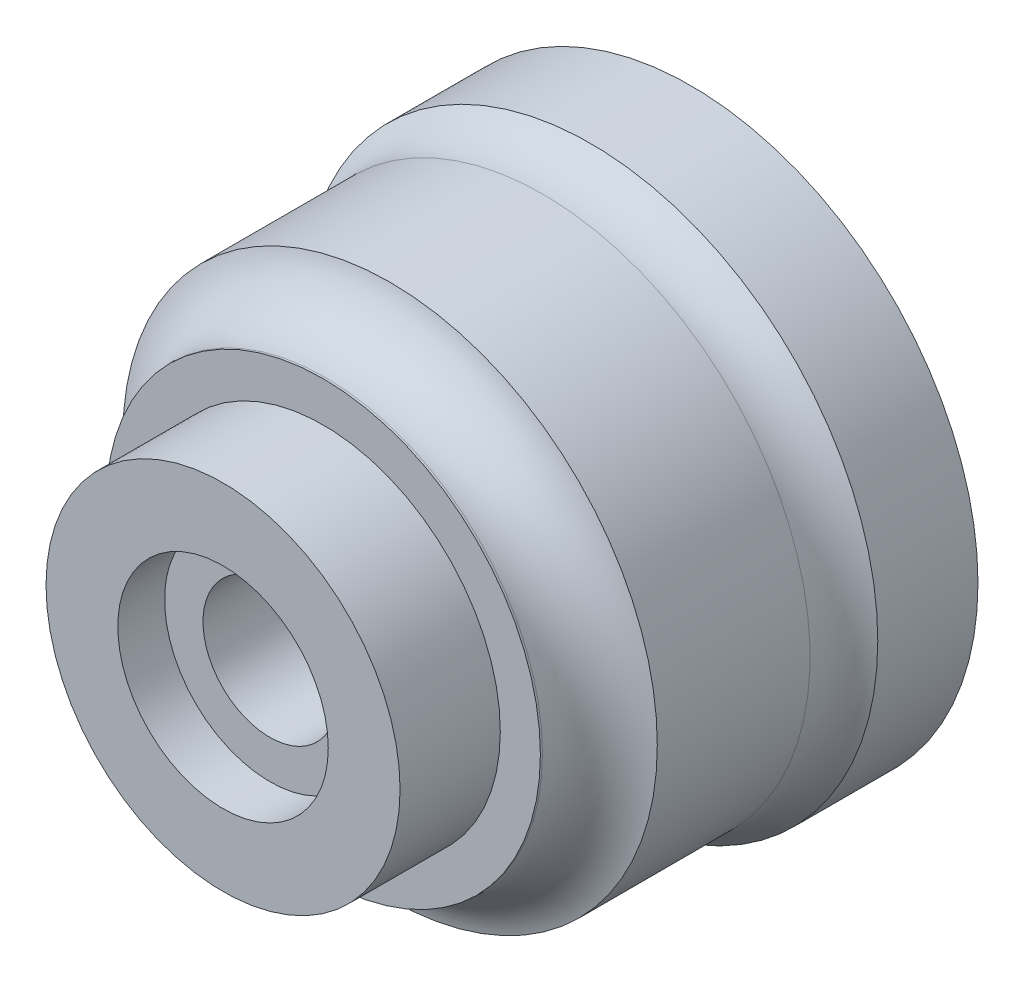
ISO-10303-21;
HEADER;
FILE_DESCRIPTION(('STEP AP214'),'2;1');
FILE_NAME('part.step','',(''),(''),'','','');
FILE_SCHEMA(('AUTOMOTIVE_DESIGN { 1 0 10303 214 1 1 1 1 }'));
ENDSEC;
DATA;
#1=APPLICATION_CONTEXT('core data for automotive mechanical design processes');
#2=APPLICATION_PROTOCOL_DEFINITION('international standard','automotive_design',2000,#1);
#3=PRODUCT_CONTEXT('',#1,'mechanical');
#4=PRODUCT('Part','Part','',(#3));
#5=PRODUCT_RELATED_PRODUCT_CATEGORY('part','',(#4));
#6=PRODUCT_DEFINITION_FORMATION('','',#4);
#7=PRODUCT_DEFINITION_CONTEXT('part definition',#1,'design');
#8=PRODUCT_DEFINITION('design','',#6,#7);
#9=PRODUCT_DEFINITION_SHAPE('','',#8);
#10=(LENGTH_UNIT() NAMED_UNIT(*) SI_UNIT(.MILLI.,.METRE.));
#11=(NAMED_UNIT(*) PLANE_ANGLE_UNIT() SI_UNIT($,.RADIAN.));
#12=(NAMED_UNIT(*) SI_UNIT($,.STERADIAN.) SOLID_ANGLE_UNIT());
#13=UNCERTAINTY_MEASURE_WITH_UNIT(LENGTH_MEASURE(1.E-05),#10,'distance_accuracy_value','');
#14=(GEOMETRIC_REPRESENTATION_CONTEXT(3) GLOBAL_UNCERTAINTY_ASSIGNED_CONTEXT((#13)) GLOBAL_UNIT_ASSIGNED_CONTEXT((#10,
#11,#12)) REPRESENTATION_CONTEXT('',''));
#15=CARTESIAN_POINT('',(0.,0.,0.));
#16=DIRECTION('',(0.,0.,1.));
#17=DIRECTION('',(1.,0.,0.));
#18=AXIS2_PLACEMENT_3D('',#15,#16,#17);
#19=CARTESIAN_POINT('',(0.,0.,55.));
#20=DIRECTION('',(0.,0.,-1.));
#21=DIRECTION('',(-1.,0.,0.));
#22=AXIS2_PLACEMENT_3D('',#19,#20,#21);
#23=CYLINDRICAL_SURFACE('',#22,10.);
#24=CARTESIAN_POINT('',(0.,0.,45.));
#25=DIRECTION('',(0.,0.,1.));
#26=DIRECTION('',(1.,0.,0.));
#27=AXIS2_PLACEMENT_3D('',#24,#25,#26);
#28=CIRCLE('',#27,10.);
#29=CARTESIAN_POINT('',(10.,0.,45.));
#30=VERTEX_POINT('',#29);
#31=EDGE_CURVE('E70',#30,#30,#28,.T.);
#32=ORIENTED_EDGE('',*,*,#31,.F.);
#33=EDGE_LOOP('',(#32));
#34=FACE_BOUND('',#33,.T.);
#35=CARTESIAN_POINT('',(0.,0.,63.));
#36=DIRECTION('',(0.,0.,1.));
#37=DIRECTION('',(1.,0.,0.));
#38=AXIS2_PLACEMENT_3D('',#35,#36,#37);
#39=CIRCLE('',#38,10.);
#40=CARTESIAN_POINT('',(10.,0.,63.));
#41=VERTEX_POINT('',#40);
#42=EDGE_CURVE('E52',#41,#41,#39,.T.);
#43=ORIENTED_EDGE('',*,*,#42,.T.);
#44=EDGE_LOOP('',(#43));
#45=FACE_BOUND('',#44,.T.);
#46=ADVANCED_FACE('F33',(#34,#45),#23,.F.);
#47=CARTESIAN_POINT('',(0.,0.,55.));
#48=DIRECTION('',(0.,0.,1.));
#49=DIRECTION('',(1.,0.,0.));
#50=AXIS2_PLACEMENT_3D('',#47,#48,#49);
#51=PLANE('',#50);
#52=CARTESIAN_POINT('',(0.,0.,55.));
#53=DIRECTION('',(0.,0.,1.));
#54=DIRECTION('',(1.,0.,0.));
#55=AXIS2_PLACEMENT_3D('',#52,#53,#54);
#56=CIRCLE('',#55,32.5);
#57=CARTESIAN_POINT('',(32.5,0.,55.));
#58=VERTEX_POINT('',#57);
#59=EDGE_CURVE('E74',#58,#58,#56,.T.);
#60=ORIENTED_EDGE('',*,*,#59,.T.);
#61=EDGE_LOOP('',(#60));
#62=FACE_BOUND('',#61,.T.);
#63=CARTESIAN_POINT('',(0.,0.,55.));
#64=DIRECTION('',(0.,0.,1.));
#65=DIRECTION('',(1.,0.,0.));
#66=AXIS2_PLACEMENT_3D('',#63,#64,#65);
#67=CIRCLE('',#66,26.5);
#68=CARTESIAN_POINT('',(26.5,0.,55.));
#69=VERTEX_POINT('',#68);
#70=EDGE_CURVE('E54',#69,#69,#67,.T.);
#71=ORIENTED_EDGE('',*,*,#70,.F.);
#72=EDGE_LOOP('',(#71));
#73=FACE_BOUND('',#72,.T.);
#74=ADVANCED_FACE('F118',(#62,#73),#51,.T.);
#75=CARTESIAN_POINT('',(0.,0.,15.));
#76=DIRECTION('',(0.,0.,1.));
#77=DIRECTION('',(1.,0.,0.));
#78=AXIS2_PLACEMENT_3D('',#75,#76,#77);
#79=PLANE('',#78);
#80=CARTESIAN_POINT('',(0.,0.,15.));
#81=DIRECTION('',(0.,0.,1.));
#82=DIRECTION('',(1.,0.,0.));
#83=AXIS2_PLACEMENT_3D('',#80,#81,#82);
#84=CIRCLE('',#83,19.);
#85=CARTESIAN_POINT('',(19.,0.,15.));
#86=VERTEX_POINT('',#85);
#87=EDGE_CURVE('E44',#86,#86,#84,.F.);
#88=ORIENTED_EDGE('',*,*,#87,.F.);
#89=EDGE_LOOP('',(#88));
#90=FACE_BOUND('',#89,.T.);
#91=CARTESIAN_POINT('',(0.,0.,15.));
#92=DIRECTION('',(0.,0.,1.));
#93=DIRECTION('',(1.,0.,0.));
#94=AXIS2_PLACEMENT_3D('',#91,#92,#93);
#95=CIRCLE('',#94,18.9);
#96=CARTESIAN_POINT('',(18.9,0.,15.));
#97=VERTEX_POINT('',#96);
#98=EDGE_CURVE('E84',#97,#97,#95,.T.);
#99=ORIENTED_EDGE('',*,*,#98,.F.);
#100=EDGE_LOOP('',(#99));
#101=FACE_BOUND('',#100,.T.);
#102=ADVANCED_FACE('F99',(#90,#101),#79,.T.);
#103=CARTESIAN_POINT('',(0.,0.,0.));
#104=DIRECTION('',(0.,0.,1.));
#105=DIRECTION('',(1.,0.,0.));
#106=AXIS2_PLACEMENT_3D('',#103,#104,#105);
#107=PLANE('',#106);
#108=CARTESIAN_POINT('',(0.,0.,0.));
#109=DIRECTION('',(0.,0.,1.));
#110=DIRECTION('',(1.,0.,0.));
#111=AXIS2_PLACEMENT_3D('',#108,#109,#110);
#112=CIRCLE('',#111,43.);
#113=CARTESIAN_POINT('',(43.,0.,0.));
#114=VERTEX_POINT('',#113);
#115=EDGE_CURVE('E87',#114,#114,#112,.T.);
#116=ORIENTED_EDGE('',*,*,#115,.F.);
#117=EDGE_LOOP('',(#116));
#118=FACE_BOUND('',#117,.T.);
#119=CARTESIAN_POINT('',(0.,0.,0.));
#120=DIRECTION('',(0.,0.,1.));
#121=DIRECTION('',(1.,0.,0.));
#122=AXIS2_PLACEMENT_3D('',#119,#120,#121);
#123=CIRCLE('',#122,18.9);
#124=CARTESIAN_POINT('',(18.9,0.,0.));
#125=VERTEX_POINT('',#124);
#126=EDGE_CURVE('E83',#125,#125,#123,.T.);
#127=ORIENTED_EDGE('',*,*,#126,.T.);
#128=EDGE_LOOP('',(#127));
#129=FACE_BOUND('',#128,.T.);
#130=ADVANCED_FACE('F96',(#118,#129),#107,.F.);
#131=CARTESIAN_POINT('',(0.,0.,15.));
#132=DIRECTION('',(0.,0.,-1.));
#133=DIRECTION('',(-1.,0.,0.));
#134=AXIS2_PLACEMENT_3D('',#131,#132,#133);
#135=CYLINDRICAL_SURFACE('',#134,43.);
#136=CARTESIAN_POINT('',(0.,0.,15.));
#137=DIRECTION('',(0.,0.,1.));
#138=DIRECTION('',(1.,0.,0.));
#139=AXIS2_PLACEMENT_3D('',#136,#137,#138);
#140=CIRCLE('',#139,43.);
#141=CARTESIAN_POINT('',(43.,0.,15.));
#142=VERTEX_POINT('',#141);
#143=EDGE_CURVE('E49',#142,#142,#140,.T.);
#144=ORIENTED_EDGE('',*,*,#143,.F.);
#145=EDGE_LOOP('',(#144));
#146=FACE_BOUND('',#145,.T.);
#147=ORIENTED_EDGE('',*,*,#115,.T.);
#148=EDGE_LOOP('',(#147));
#149=FACE_BOUND('',#148,.T.);
#150=ADVANCED_FACE('F94',(#146,#149),#135,.T.);
#151=CARTESIAN_POINT('',(0.,0.,15.));
#152=DIRECTION('',(0.,0.,-1.));
#153=DIRECTION('',(-1.,0.,0.));
#154=AXIS2_PLACEMENT_3D('',#151,#152,#153);
#155=CYLINDRICAL_SURFACE('',#154,18.9);
#156=ORIENTED_EDGE('',*,*,#98,.T.);
#157=EDGE_LOOP('',(#156));
#158=FACE_BOUND('',#157,.T.);
#159=ORIENTED_EDGE('',*,*,#126,.F.);
#160=EDGE_LOOP('',(#159));
#161=FACE_BOUND('',#160,.T.);
#162=ADVANCED_FACE('F103',(#158,#161),#155,.F.);
#163=CARTESIAN_POINT('',(0.,0.,45.));
#164=DIRECTION('',(0.,0.,-1.));
#165=DIRECTION('',(-1.,0.,0.));
#166=AXIS2_PLACEMENT_3D('',#163,#164,#165);
#167=CYLINDRICAL_SURFACE('',#166,40.);
#168=CARTESIAN_POINT('',(0.,0.,22.1414284285428));
#169=DIRECTION('',(0.,0.,-1.));
#170=DIRECTION('',(-1.,0.,0.));
#171=AXIS2_PLACEMENT_3D('',#168,#169,#170);
#172=CIRCLE('',#171,40.);
#173=CARTESIAN_POINT('',(-40.,0.,22.1414284285428));
#174=VERTEX_POINT('',#173);
#175=EDGE_CURVE('E40',#174,#174,#172,.F.);
#176=ORIENTED_EDGE('',*,*,#175,.T.);
#177=EDGE_LOOP('',(#176));
#178=FACE_BOUND('',#177,.T.);
#179=CARTESIAN_POINT('',(0.,0.,45.));
#180=DIRECTION('',(0.,0.,1.));
#181=DIRECTION('',(1.,0.,0.));
#182=AXIS2_PLACEMENT_3D('',#179,#180,#181);
#183=CIRCLE('',#182,40.);
#184=CARTESIAN_POINT('',(40.,0.,45.));
#185=VERTEX_POINT('',#184);
#186=EDGE_CURVE('E80',#185,#185,#183,.T.);
#187=ORIENTED_EDGE('',*,*,#186,.F.);
#188=EDGE_LOOP('',(#187));
#189=FACE_BOUND('',#188,.T.);
#190=ADVANCED_FACE('F105',(#178,#189),#167,.T.);
#191=CARTESIAN_POINT('',(0.,0.,45.));
#192=DIRECTION('',(0.,0.,-1.));
#193=DIRECTION('',(-1.,0.,0.));
#194=AXIS2_PLACEMENT_3D('',#191,#192,#193);
#195=CYLINDRICAL_SURFACE('',#194,19.);
#196=CARTESIAN_POINT('',(0.,0.,45.));
#197=DIRECTION('',(0.,0.,1.));
#198=DIRECTION('',(1.,0.,0.));
#199=AXIS2_PLACEMENT_3D('',#196,#197,#198);
#200=CIRCLE('',#199,19.);
#201=CARTESIAN_POINT('',(19.,0.,45.));
#202=VERTEX_POINT('',#201);
#203=EDGE_CURVE('E77',#202,#202,#200,.T.);
#204=ORIENTED_EDGE('',*,*,#203,.T.);
#205=EDGE_LOOP('',(#204));
#206=FACE_BOUND('',#205,.T.);
#207=ORIENTED_EDGE('',*,*,#87,.T.);
#208=EDGE_LOOP('',(#207));
#209=FACE_BOUND('',#208,.T.);
#210=ADVANCED_FACE('F112',(#206,#209),#195,.F.);
#211=CARTESIAN_POINT('',(0.,0.,45.));
#212=DIRECTION('',(0.,0.,1.));
#213=DIRECTION('',(1.,0.,0.));
#214=AXIS2_PLACEMENT_3D('',#211,#212,#213);
#215=PLANE('',#214);
#216=ORIENTED_EDGE('',*,*,#203,.F.);
#217=EDGE_LOOP('',(#216));
#218=FACE_BOUND('',#217,.T.);
#219=ORIENTED_EDGE('',*,*,#31,.T.);
#220=EDGE_LOOP('',(#219));
#221=FACE_BOUND('',#220,.T.);
#222=ADVANCED_FACE('F131',(#218,#221),#215,.F.);
#223=CARTESIAN_POINT('',(0.,0.,55.));
#224=DIRECTION('',(0.,0.,-1.));
#225=DIRECTION('',(-1.,0.,0.));
#226=AXIS2_PLACEMENT_3D('',#223,#224,#225);
#227=CYLINDRICAL_SURFACE('',#226,32.5);
#228=CARTESIAN_POINT('',(0.,0.,54.6824583655185));
#229=DIRECTION('',(0.,0.,-1.));
#230=DIRECTION('',(-1.,0.,0.));
#231=AXIS2_PLACEMENT_3D('',#228,#229,#230);
#232=CIRCLE('',#231,32.5);
#233=CARTESIAN_POINT('',(-32.5,0.,54.6824583655185));
#234=VERTEX_POINT('',#233);
#235=EDGE_CURVE('E10',#234,#234,#232,.F.);
#236=ORIENTED_EDGE('',*,*,#235,.T.);
#237=EDGE_LOOP('',(#236));
#238=FACE_BOUND('',#237,.T.);
#239=ORIENTED_EDGE('',*,*,#59,.F.);
#240=EDGE_LOOP('',(#239));
#241=FACE_BOUND('',#240,.T.);
#242=ADVANCED_FACE('F134',(#238,#241),#227,.T.);
#243=CARTESIAN_POINT('',(0.,0.,22.1414284285428));
#244=DIRECTION('',(0.,0.,-1.));
#245=DIRECTION('',(-1.,0.,0.));
#246=AXIS2_PLACEMENT_3D('',#243,#244,#245);
#247=TOROIDAL_SURFACE('',#246,50.,10.);
#248=ORIENTED_EDGE('',*,*,#143,.T.);
#249=EDGE_LOOP('',(#248));
#250=FACE_BOUND('',#249,.T.);
#251=ORIENTED_EDGE('',*,*,#175,.F.);
#252=EDGE_LOOP('',(#251));
#253=FACE_BOUND('',#252,.T.);
#254=ADVANCED_FACE('F138',(#250,#253),#247,.F.);
#255=CARTESIAN_POINT('',(0.,0.,70.));
#256=DIRECTION('',(0.,0.,1.));
#257=DIRECTION('',(1.,0.,0.));
#258=AXIS2_PLACEMENT_3D('',#255,#256,#257);
#259=PLANE('',#258);
#260=CARTESIAN_POINT('',(0.,0.,70.));
#261=DIRECTION('',(0.,0.,1.));
#262=DIRECTION('',(1.,0.,0.));
#263=AXIS2_PLACEMENT_3D('',#260,#261,#262);
#264=CIRCLE('',#263,15.75);
#265=CARTESIAN_POINT('',(15.75,0.,70.));
#266=VERTEX_POINT('',#265);
#267=EDGE_CURVE('E62',#266,#266,#264,.T.);
#268=ORIENTED_EDGE('',*,*,#267,.F.);
#269=EDGE_LOOP('',(#268));
#270=FACE_BOUND('',#269,.T.);
#271=CARTESIAN_POINT('',(0.,0.,70.));
#272=DIRECTION('',(0.,0.,1.));
#273=DIRECTION('',(1.,0.,0.));
#274=AXIS2_PLACEMENT_3D('',#271,#272,#273);
#275=CIRCLE('',#274,26.5);
#276=CARTESIAN_POINT('',(26.5,0.,70.));
#277=VERTEX_POINT('',#276);
#278=EDGE_CURVE('E59',#277,#277,#275,.T.);
#279=ORIENTED_EDGE('',*,*,#278,.T.);
#280=EDGE_LOOP('',(#279));
#281=FACE_BOUND('',#280,.T.);
#282=ADVANCED_FACE('F153',(#270,#281),#259,.T.);
#283=CARTESIAN_POINT('',(0.,0.,70.));
#284=DIRECTION('',(0.,0.,-1.));
#285=DIRECTION('',(-1.,0.,0.));
#286=AXIS2_PLACEMENT_3D('',#283,#284,#285);
#287=CYLINDRICAL_SURFACE('',#286,26.5);
#288=ORIENTED_EDGE('',*,*,#278,.F.);
#289=EDGE_LOOP('',(#288));
#290=FACE_BOUND('',#289,.T.);
#291=ORIENTED_EDGE('',*,*,#70,.T.);
#292=EDGE_LOOP('',(#291));
#293=FACE_BOUND('',#292,.T.);
#294=ADVANCED_FACE('F128',(#290,#293),#287,.T.);
#295=CARTESIAN_POINT('',(0.,0.,63.));
#296=DIRECTION('',(0.,0.,1.));
#297=DIRECTION('',(1.,0.,0.));
#298=AXIS2_PLACEMENT_3D('',#295,#296,#297);
#299=CYLINDRICAL_SURFACE('',#298,15.75);
#300=CARTESIAN_POINT('',(0.,0.,63.));
#301=DIRECTION('',(0.,0.,1.));
#302=DIRECTION('',(1.,0.,0.));
#303=AXIS2_PLACEMENT_3D('',#300,#301,#302);
#304=CIRCLE('',#303,15.75);
#305=CARTESIAN_POINT('',(15.75,0.,63.));
#306=VERTEX_POINT('',#305);
#307=EDGE_CURVE('E55',#306,#306,#304,.T.);
#308=ORIENTED_EDGE('',*,*,#307,.F.);
#309=EDGE_LOOP('',(#308));
#310=FACE_BOUND('',#309,.T.);
#311=ORIENTED_EDGE('',*,*,#267,.T.);
#312=EDGE_LOOP('',(#311));
#313=FACE_BOUND('',#312,.T.);
#314=ADVANCED_FACE('F164',(#310,#313),#299,.F.);
#315=CARTESIAN_POINT('',(0.,0.,63.));
#316=DIRECTION('',(0.,0.,1.));
#317=DIRECTION('',(1.,0.,0.));
#318=AXIS2_PLACEMENT_3D('',#315,#316,#317);
#319=PLANE('',#318);
#320=ORIENTED_EDGE('',*,*,#42,.F.);
#321=EDGE_LOOP('',(#320));
#322=FACE_BOUND('',#321,.T.);
#323=ORIENTED_EDGE('',*,*,#307,.T.);
#324=EDGE_LOOP('',(#323));
#325=FACE_BOUND('',#324,.T.);
#326=ADVANCED_FACE('F171',(#322,#325),#319,.T.);
#327=CARTESIAN_POINT('',(0.,0.,54.6824583655185));
#328=DIRECTION('',(0.,0.,-1.));
#329=DIRECTION('',(-1.,0.,0.));
#330=AXIS2_PLACEMENT_3D('',#327,#328,#329);
#331=TOROIDAL_SURFACE('',#330,42.5,10.);
#332=ORIENTED_EDGE('',*,*,#186,.T.);
#333=EDGE_LOOP('',(#332));
#334=FACE_BOUND('',#333,.T.);
#335=ORIENTED_EDGE('',*,*,#235,.F.);
#336=EDGE_LOOP('',(#335));
#337=FACE_BOUND('',#336,.T.);
#338=ADVANCED_FACE('F35',(#334,#337),#331,.F.);
#339=CLOSED_SHELL('',(#46,#74,#102,#130,#150,#162,#190,#210,#222,#242,#254,#282,#294,#314,#326,#338));
#340=MANIFOLD_SOLID_BREP('B2',#339);
#341=ADVANCED_BREP_SHAPE_REPRESENTATION('',(#18,#340),#14);
#342=SHAPE_DEFINITION_REPRESENTATION(#9,#341);
ENDSEC;
END-ISO-10303-21;
